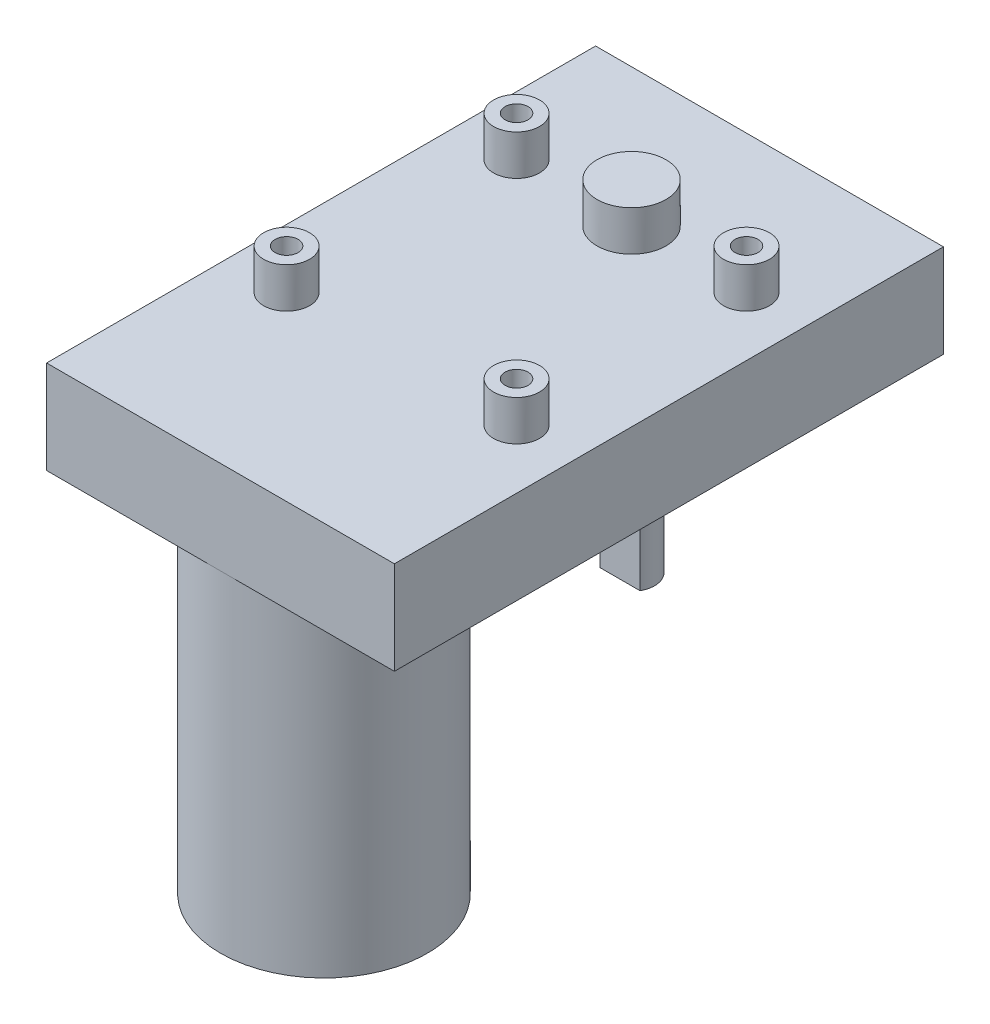
ISO-10303-21;
HEADER;
FILE_DESCRIPTION(('STEP AP214'),'2;1');
FILE_NAME('part.step','',(''),(''),'','','');
FILE_SCHEMA(('AUTOMOTIVE_DESIGN { 1 0 10303 214 1 1 1 1 }'));
ENDSEC;
DATA;
#1=APPLICATION_CONTEXT('core data for automotive mechanical design processes');
#2=APPLICATION_PROTOCOL_DEFINITION('international standard','automotive_design',2000,#1);
#3=PRODUCT_CONTEXT('',#1,'mechanical');
#4=PRODUCT('Part','Part','',(#3));
#5=PRODUCT_RELATED_PRODUCT_CATEGORY('part','',(#4));
#6=PRODUCT_DEFINITION_FORMATION('','',#4);
#7=PRODUCT_DEFINITION_CONTEXT('part definition',#1,'design');
#8=PRODUCT_DEFINITION('design','',#6,#7);
#9=PRODUCT_DEFINITION_SHAPE('','',#8);
#10=(LENGTH_UNIT() NAMED_UNIT(*) SI_UNIT(.MILLI.,.METRE.));
#11=(NAMED_UNIT(*) PLANE_ANGLE_UNIT() SI_UNIT($,.RADIAN.));
#12=(NAMED_UNIT(*) SI_UNIT($,.STERADIAN.) SOLID_ANGLE_UNIT());
#13=UNCERTAINTY_MEASURE_WITH_UNIT(LENGTH_MEASURE(1.E-05),#10,'distance_accuracy_value','');
#14=(GEOMETRIC_REPRESENTATION_CONTEXT(3) GLOBAL_UNCERTAINTY_ASSIGNED_CONTEXT((#13)) GLOBAL_UNIT_ASSIGNED_CONTEXT((#10,
#11,#12)) REPRESENTATION_CONTEXT('',''));
#15=CARTESIAN_POINT('',(0.,0.,0.));
#16=DIRECTION('',(0.,0.,1.));
#17=DIRECTION('',(1.,0.,0.));
#18=AXIS2_PLACEMENT_3D('',#15,#16,#17);
#19=CARTESIAN_POINT('',(-30.25,16.2,71.5));
#20=DIRECTION('',(-1.,0.,0.));
#21=DIRECTION('',(0.,0.,1.));
#22=AXIS2_PLACEMENT_3D('',#19,#20,#21);
#23=PLANE('',#22);
#24=DIRECTION('',(0.,0.,-1.));
#25=VECTOR('',#24,1.);
#26=CARTESIAN_POINT('',(-30.25,0.,71.5));
#27=LINE('',#26,#25);
#28=CARTESIAN_POINT('',(-30.25,0.,71.5));
#29=VERTEX_POINT('',#28);
#30=CARTESIAN_POINT('',(-30.25,0.,-24.));
#31=VERTEX_POINT('',#30);
#32=EDGE_CURVE('E164',#29,#31,#27,.T.);
#33=ORIENTED_EDGE('',*,*,#32,.F.);
#34=DIRECTION('',(0.,-1.,0.));
#35=VECTOR('',#34,1.);
#36=CARTESIAN_POINT('',(-30.25,16.2,71.5));
#37=LINE('',#36,#35);
#38=CARTESIAN_POINT('',(-30.25,16.2,71.5));
#39=VERTEX_POINT('',#38);
#40=EDGE_CURVE('E188',#39,#29,#37,.T.);
#41=ORIENTED_EDGE('',*,*,#40,.F.);
#42=DIRECTION('',(0.,0.,-1.));
#43=VECTOR('',#42,1.);
#44=CARTESIAN_POINT('',(-30.25,16.2,71.5));
#45=LINE('',#44,#43);
#46=CARTESIAN_POINT('',(-30.25,16.2,-24.));
#47=VERTEX_POINT('',#46);
#48=EDGE_CURVE('E165',#39,#47,#45,.T.);
#49=ORIENTED_EDGE('',*,*,#48,.T.);
#50=DIRECTION('',(0.,-1.,0.));
#51=VECTOR('',#50,1.);
#52=CARTESIAN_POINT('',(-30.25,16.2,-24.));
#53=LINE('',#52,#51);
#54=EDGE_CURVE('E176',#47,#31,#53,.T.);
#55=ORIENTED_EDGE('',*,*,#54,.T.);
#56=EDGE_LOOP('',(#33,#41,#49,#55));
#57=FACE_BOUND('',#56,.T.);
#58=ADVANCED_FACE('F41',(#57),#23,.T.);
#59=CARTESIAN_POINT('',(-30.25,16.2,71.5));
#60=DIRECTION('',(0.,0.,-1.));
#61=DIRECTION('',(-1.,0.,0.));
#62=AXIS2_PLACEMENT_3D('',#59,#60,#61);
#63=PLANE('',#62);
#64=DIRECTION('',(1.,0.,0.));
#65=VECTOR('',#64,1.);
#66=CARTESIAN_POINT('',(-30.25,0.,71.5));
#67=LINE('',#66,#65);
#68=CARTESIAN_POINT('',(0.,0.,71.5));
#69=VERTEX_POINT('',#68);
#70=EDGE_CURVE('E169',#29,#69,#67,.T.);
#71=ORIENTED_EDGE('',*,*,#70,.T.);
#72=CARTESIAN_POINT('',(30.25,0.,71.5));
#73=VERTEX_POINT('',#72);
#74=EDGE_CURVE('E185',#69,#73,#67,.T.);
#75=ORIENTED_EDGE('',*,*,#74,.T.);
#76=DIRECTION('',(0.,-1.,0.));
#77=VECTOR('',#76,1.);
#78=CARTESIAN_POINT('',(30.25,16.2,71.5));
#79=LINE('',#78,#77);
#80=CARTESIAN_POINT('',(30.25,16.2,71.5));
#81=VERTEX_POINT('',#80);
#82=EDGE_CURVE('E191',#81,#73,#79,.T.);
#83=ORIENTED_EDGE('',*,*,#82,.F.);
#84=DIRECTION('',(1.,0.,0.));
#85=VECTOR('',#84,1.);
#86=CARTESIAN_POINT('',(-30.25,16.2,71.5));
#87=LINE('',#86,#85);
#88=EDGE_CURVE('E174',#39,#81,#87,.T.);
#89=ORIENTED_EDGE('',*,*,#88,.F.);
#90=ORIENTED_EDGE('',*,*,#40,.T.);
#91=EDGE_LOOP('',(#71,#75,#83,#89,#90));
#92=FACE_BOUND('',#91,.T.);
#93=ADVANCED_FACE('F250',(#92),#63,.F.);
#94=CARTESIAN_POINT('',(30.25,16.2,71.5));
#95=DIRECTION('',(-1.,0.,0.));
#96=DIRECTION('',(0.,0.,1.));
#97=AXIS2_PLACEMENT_3D('',#94,#95,#96);
#98=PLANE('',#97);
#99=DIRECTION('',(0.,0.,-1.));
#100=VECTOR('',#99,1.);
#101=CARTESIAN_POINT('',(30.25,0.,71.5));
#102=LINE('',#101,#100);
#103=CARTESIAN_POINT('',(30.25,0.,-24.));
#104=VERTEX_POINT('',#103);
#105=EDGE_CURVE('E182',#73,#104,#102,.T.);
#106=ORIENTED_EDGE('',*,*,#105,.T.);
#107=DIRECTION('',(0.,-1.,0.));
#108=VECTOR('',#107,1.);
#109=CARTESIAN_POINT('',(30.25,16.2,-24.));
#110=LINE('',#109,#108);
#111=CARTESIAN_POINT('',(30.25,16.2,-24.));
#112=VERTEX_POINT('',#111);
#113=EDGE_CURVE('E194',#112,#104,#110,.T.);
#114=ORIENTED_EDGE('',*,*,#113,.F.);
#115=DIRECTION('',(0.,0.,-1.));
#116=VECTOR('',#115,1.);
#117=CARTESIAN_POINT('',(30.25,16.2,71.5));
#118=LINE('',#117,#116);
#119=EDGE_CURVE('E172',#81,#112,#118,.T.);
#120=ORIENTED_EDGE('',*,*,#119,.F.);
#121=ORIENTED_EDGE('',*,*,#82,.T.);
#122=EDGE_LOOP('',(#106,#114,#120,#121));
#123=FACE_BOUND('',#122,.T.);
#124=ADVANCED_FACE('F255',(#123),#98,.F.);
#125=CARTESIAN_POINT('',(-30.25,16.2,-24.));
#126=DIRECTION('',(0.,0.,-1.));
#127=DIRECTION('',(-1.,0.,0.));
#128=AXIS2_PLACEMENT_3D('',#125,#126,#127);
#129=PLANE('',#128);
#130=DIRECTION('',(1.,0.,0.));
#131=VECTOR('',#130,1.);
#132=CARTESIAN_POINT('',(-30.25,0.,-24.));
#133=LINE('',#132,#131);
#134=EDGE_CURVE('E179',#31,#104,#133,.T.);
#135=ORIENTED_EDGE('',*,*,#134,.F.);
#136=ORIENTED_EDGE('',*,*,#54,.F.);
#137=DIRECTION('',(1.,0.,0.));
#138=VECTOR('',#137,1.);
#139=CARTESIAN_POINT('',(-30.25,16.2,-24.));
#140=LINE('',#139,#138);
#141=EDGE_CURVE('E168',#47,#112,#140,.T.);
#142=ORIENTED_EDGE('',*,*,#141,.T.);
#143=ORIENTED_EDGE('',*,*,#113,.T.);
#144=EDGE_LOOP('',(#135,#136,#142,#143));
#145=FACE_BOUND('',#144,.T.);
#146=ADVANCED_FACE('F272',(#145),#129,.T.);
#147=CARTESIAN_POINT('',(0.,16.2,0.));
#148=DIRECTION('',(0.,-1.,0.));
#149=DIRECTION('',(0.,0.,-1.));
#150=AXIS2_PLACEMENT_3D('',#147,#148,#149);
#151=PLANE('',#150);
#152=CARTESIAN_POINT('',(-20.,16.2,40.));
#153=DIRECTION('',(0.,-1.,0.));
#154=DIRECTION('',(0.,0.,-1.));
#155=AXIS2_PLACEMENT_3D('',#152,#153,#154);
#156=CIRCLE('',#155,4.);
#157=CARTESIAN_POINT('',(-20.,16.2,36.));
#158=VERTEX_POINT('',#157);
#159=EDGE_CURVE('E208',#158,#158,#156,.F.);
#160=ORIENTED_EDGE('',*,*,#159,.F.);
#161=EDGE_LOOP('',(#160));
#162=FACE_BOUND('',#161,.T.);
#163=CARTESIAN_POINT('',(20.,16.2,40.));
#164=DIRECTION('',(0.,-1.,0.));
#165=DIRECTION('',(0.,0.,-1.));
#166=AXIS2_PLACEMENT_3D('',#163,#164,#165);
#167=CIRCLE('',#166,4.);
#168=CARTESIAN_POINT('',(20.,16.2,36.));
#169=VERTEX_POINT('',#168);
#170=EDGE_CURVE('E205',#169,#169,#167,.F.);
#171=ORIENTED_EDGE('',*,*,#170,.F.);
#172=EDGE_LOOP('',(#171));
#173=FACE_BOUND('',#172,.T.);
#174=CARTESIAN_POINT('',(20.,16.2,0.));
#175=DIRECTION('',(0.,-1.,0.));
#176=DIRECTION('',(0.,0.,-1.));
#177=AXIS2_PLACEMENT_3D('',#174,#175,#176);
#178=CIRCLE('',#177,4.);
#179=CARTESIAN_POINT('',(20.,16.2,-4.));
#180=VERTEX_POINT('',#179);
#181=EDGE_CURVE('E202',#180,#180,#178,.F.);
#182=ORIENTED_EDGE('',*,*,#181,.F.);
#183=EDGE_LOOP('',(#182));
#184=FACE_BOUND('',#183,.T.);
#185=CARTESIAN_POINT('',(-20.,16.2,0.));
#186=DIRECTION('',(0.,-1.,0.));
#187=DIRECTION('',(0.,0.,-1.));
#188=AXIS2_PLACEMENT_3D('',#185,#186,#187);
#189=CIRCLE('',#188,4.);
#190=CARTESIAN_POINT('',(-20.,16.2,-4.));
#191=VERTEX_POINT('',#190);
#192=EDGE_CURVE('E199',#191,#191,#189,.F.);
#193=ORIENTED_EDGE('',*,*,#192,.F.);
#194=EDGE_LOOP('',(#193));
#195=FACE_BOUND('',#194,.T.);
#196=CARTESIAN_POINT('',(0.,16.2,0.));
#197=DIRECTION('',(0.,-1.,0.));
#198=DIRECTION('',(0.,0.,-1.));
#199=AXIS2_PLACEMENT_3D('',#196,#197,#198);
#200=CIRCLE('',#199,6.);
#201=CARTESIAN_POINT('',(0.,16.2,-6.));
#202=VERTEX_POINT('',#201);
#203=EDGE_CURVE('E190',#202,#202,#200,.F.);
#204=ORIENTED_EDGE('',*,*,#203,.F.);
#205=EDGE_LOOP('',(#204));
#206=FACE_BOUND('',#205,.T.);
#207=ORIENTED_EDGE('',*,*,#48,.F.);
#208=ORIENTED_EDGE('',*,*,#88,.T.);
#209=ORIENTED_EDGE('',*,*,#119,.T.);
#210=ORIENTED_EDGE('',*,*,#141,.F.);
#211=EDGE_LOOP('',(#207,#208,#209,#210));
#212=FACE_BOUND('',#211,.T.);
#213=ADVANCED_FACE('F269',(#162,#173,#184,#195,#206,#212),#151,.F.);
#214=CARTESIAN_POINT('',(0.,0.,0.));
#215=DIRECTION('',(0.,-1.,0.));
#216=DIRECTION('',(0.,0.,-1.));
#217=AXIS2_PLACEMENT_3D('',#214,#215,#216);
#218=PLANE('',#217);
#219=CARTESIAN_POINT('',(17.5,0.,12.5));
#220=DIRECTION('',(0.,-1.,0.));
#221=DIRECTION('',(0.,0.,-1.));
#222=AXIS2_PLACEMENT_3D('',#219,#220,#221);
#223=CIRCLE('',#222,4.);
#224=CARTESIAN_POINT('',(17.5,0.,8.5));
#225=VERTEX_POINT('',#224);
#226=EDGE_CURVE('E688',#225,#225,#223,.T.);
#227=ORIENTED_EDGE('',*,*,#226,.F.);
#228=EDGE_LOOP('',(#227));
#229=FACE_BOUND('',#228,.T.);
#230=CARTESIAN_POINT('',(-17.5,0.,12.5));
#231=DIRECTION('',(0.,-1.,0.));
#232=DIRECTION('',(0.,0.,-1.));
#233=AXIS2_PLACEMENT_3D('',#230,#231,#232);
#234=CIRCLE('',#233,4.);
#235=CARTESIAN_POINT('',(-17.5,0.,8.5));
#236=VERTEX_POINT('',#235);
#237=EDGE_CURVE('E700',#236,#236,#234,.T.);
#238=ORIENTED_EDGE('',*,*,#237,.F.);
#239=EDGE_LOOP('',(#238));
#240=FACE_BOUND('',#239,.T.);
#241=CARTESIAN_POINT('',(-17.5,0.,-12.5));
#242=DIRECTION('',(0.,-1.,0.));
#243=DIRECTION('',(0.,0.,-1.));
#244=AXIS2_PLACEMENT_3D('',#241,#242,#243);
#245=CIRCLE('',#244,4.);
#246=CARTESIAN_POINT('',(-17.5,0.,-16.5));
#247=VERTEX_POINT('',#246);
#248=EDGE_CURVE('E709',#247,#247,#245,.T.);
#249=ORIENTED_EDGE('',*,*,#248,.F.);
#250=EDGE_LOOP('',(#249));
#251=FACE_BOUND('',#250,.T.);
#252=CARTESIAN_POINT('',(17.5,0.,-12.5));
#253=DIRECTION('',(0.,-1.,0.));
#254=DIRECTION('',(0.,0.,-1.));
#255=AXIS2_PLACEMENT_3D('',#252,#253,#254);
#256=CIRCLE('',#255,4.);
#257=CARTESIAN_POINT('',(17.5,0.,-16.5));
#258=VERTEX_POINT('',#257);
#259=EDGE_CURVE('E718',#258,#258,#256,.T.);
#260=ORIENTED_EDGE('',*,*,#259,.F.);
#261=EDGE_LOOP('',(#260));
#262=FACE_BOUND('',#261,.T.);
#263=CARTESIAN_POINT('',(0.,0.,0.));
#264=DIRECTION('',(0.,-1.,0.));
#265=DIRECTION('',(0.,0.,-1.));
#266=AXIS2_PLACEMENT_3D('',#263,#264,#265);
#267=CIRCLE('',#266,6.);
#268=CARTESIAN_POINT('',(0.,0.,-6.));
#269=VERTEX_POINT('',#268);
#270=EDGE_CURVE('E117',#269,#269,#267,.T.);
#271=ORIENTED_EDGE('',*,*,#270,.F.);
#272=EDGE_LOOP('',(#271));
#273=FACE_BOUND('',#272,.T.);
#274=ORIENTED_EDGE('',*,*,#74,.F.);
#275=CARTESIAN_POINT('',(0.,0.,53.5));
#276=DIRECTION('',(0.,-1.,0.));
#277=DIRECTION('',(0.,0.,-1.));
#278=AXIS2_PLACEMENT_3D('',#275,#276,#277);
#279=CIRCLE('',#278,18.);
#280=EDGE_CURVE('E53',#69,#69,#279,.T.);
#281=ORIENTED_EDGE('',*,*,#280,.F.);
#282=ORIENTED_EDGE('',*,*,#70,.F.);
#283=ORIENTED_EDGE('',*,*,#32,.T.);
#284=ORIENTED_EDGE('',*,*,#134,.T.);
#285=ORIENTED_EDGE('',*,*,#105,.F.);
#286=EDGE_LOOP('',(#274,#281,#282,#283,#284,#285));
#287=FACE_BOUND('',#286,.T.);
#288=ADVANCED_FACE('F237',(#229,#240,#251,#262,#273,#287),#218,.T.);
#289=CARTESIAN_POINT('',(0.,23.2,0.));
#290=DIRECTION('',(0.,-1.,0.));
#291=DIRECTION('',(0.,0.,-1.));
#292=AXIS2_PLACEMENT_3D('',#289,#290,#291);
#293=CYLINDRICAL_SURFACE('',#292,6.);
#294=CARTESIAN_POINT('',(0.,23.2,0.));
#295=DIRECTION('',(0.,1.,0.));
#296=DIRECTION('',(0.,0.,1.));
#297=AXIS2_PLACEMENT_3D('',#294,#295,#296);
#298=CIRCLE('',#297,6.);
#299=CARTESIAN_POINT('',(0.,23.2,6.));
#300=VERTEX_POINT('',#299);
#301=EDGE_CURVE('E161',#300,#300,#298,.T.);
#302=ORIENTED_EDGE('',*,*,#301,.F.);
#303=EDGE_LOOP('',(#302));
#304=FACE_BOUND('',#303,.T.);
#305=ORIENTED_EDGE('',*,*,#203,.T.);
#306=EDGE_LOOP('',(#305));
#307=FACE_BOUND('',#306,.T.);
#308=ADVANCED_FACE('F288',(#304,#307),#293,.T.);
#309=CARTESIAN_POINT('',(0.,23.2,0.));
#310=DIRECTION('',(0.,1.,0.));
#311=DIRECTION('',(0.,0.,1.));
#312=AXIS2_PLACEMENT_3D('',#309,#310,#311);
#313=PLANE('',#312);
#314=ORIENTED_EDGE('',*,*,#301,.T.);
#315=EDGE_LOOP('',(#314));
#316=FACE_BOUND('',#315,.T.);
#317=ADVANCED_FACE('F354',(#316),#313,.T.);
#318=CARTESIAN_POINT('',(-20.,23.2,0.));
#319=DIRECTION('',(0.,1.,0.));
#320=DIRECTION('',(0.,0.,1.));
#321=AXIS2_PLACEMENT_3D('',#318,#319,#320);
#322=PLANE('',#321);
#323=CARTESIAN_POINT('',(-20.,23.2,0.));
#324=DIRECTION('',(0.,1.,0.));
#325=DIRECTION('',(0.,0.,1.));
#326=AXIS2_PLACEMENT_3D('',#323,#324,#325);
#327=CIRCLE('',#326,4.);
#328=CARTESIAN_POINT('',(-20.,23.2,4.));
#329=VERTEX_POINT('',#328);
#330=EDGE_CURVE('E156',#329,#329,#327,.T.);
#331=ORIENTED_EDGE('',*,*,#330,.T.);
#332=EDGE_LOOP('',(#331));
#333=FACE_BOUND('',#332,.T.);
#334=CARTESIAN_POINT('',(-20.,23.2,0.));
#335=DIRECTION('',(0.,1.,0.));
#336=DIRECTION('',(0.,0.,1.));
#337=AXIS2_PLACEMENT_3D('',#334,#335,#336);
#338=CIRCLE('',#337,2.);
#339=CARTESIAN_POINT('',(-20.,23.2,2.));
#340=VERTEX_POINT('',#339);
#341=EDGE_CURVE('E153',#340,#340,#338,.T.);
#342=ORIENTED_EDGE('',*,*,#341,.F.);
#343=EDGE_LOOP('',(#342));
#344=FACE_BOUND('',#343,.T.);
#345=ADVANCED_FACE('F351',(#333,#344),#322,.T.);
#346=CARTESIAN_POINT('',(-20.,23.2,0.));
#347=DIRECTION('',(0.,-1.,0.));
#348=DIRECTION('',(0.,0.,-1.));
#349=AXIS2_PLACEMENT_3D('',#346,#347,#348);
#350=CYLINDRICAL_SURFACE('',#349,4.);
#351=ORIENTED_EDGE('',*,*,#330,.F.);
#352=EDGE_LOOP('',(#351));
#353=FACE_BOUND('',#352,.T.);
#354=ORIENTED_EDGE('',*,*,#192,.T.);
#355=EDGE_LOOP('',(#354));
#356=FACE_BOUND('',#355,.T.);
#357=ADVANCED_FACE('F310',(#353,#356),#350,.T.);
#358=CARTESIAN_POINT('',(-20.,23.2,0.));
#359=DIRECTION('',(0.,-1.,0.));
#360=DIRECTION('',(0.,0.,-1.));
#361=AXIS2_PLACEMENT_3D('',#358,#359,#360);
#362=CYLINDRICAL_SURFACE('',#361,2.);
#363=ORIENTED_EDGE('',*,*,#341,.T.);
#364=EDGE_LOOP('',(#363));
#365=FACE_BOUND('',#364,.T.);
#366=CARTESIAN_POINT('',(-20.,16.2,0.));
#367=DIRECTION('',(0.,1.,0.));
#368=DIRECTION('',(0.,0.,1.));
#369=AXIS2_PLACEMENT_3D('',#366,#367,#368);
#370=CIRCLE('',#369,2.);
#371=CARTESIAN_POINT('',(-20.,16.2,2.));
#372=VERTEX_POINT('',#371);
#373=EDGE_CURVE('E152',#372,#372,#370,.T.);
#374=ORIENTED_EDGE('',*,*,#373,.F.);
#375=EDGE_LOOP('',(#374));
#376=FACE_BOUND('',#375,.T.);
#377=ADVANCED_FACE('F300',(#365,#376),#362,.F.);
#378=ORIENTED_EDGE('',*,*,#373,.T.);
#379=EDGE_LOOP('',(#378));
#380=FACE_BOUND('',#379,.T.);
#381=ADVANCED_FACE('F284',(#380),#151,.F.);
#382=CARTESIAN_POINT('',(20.,23.2,0.));
#383=DIRECTION('',(0.,1.,0.));
#384=DIRECTION('',(0.,0.,1.));
#385=AXIS2_PLACEMENT_3D('',#382,#383,#384);
#386=PLANE('',#385);
#387=CARTESIAN_POINT('',(20.,23.2,0.));
#388=DIRECTION('',(0.,1.,0.));
#389=DIRECTION('',(0.,0.,1.));
#390=AXIS2_PLACEMENT_3D('',#387,#388,#389);
#391=CIRCLE('',#390,4.);
#392=CARTESIAN_POINT('',(20.,23.2,4.));
#393=VERTEX_POINT('',#392);
#394=EDGE_CURVE('E147',#393,#393,#391,.T.);
#395=ORIENTED_EDGE('',*,*,#394,.T.);
#396=EDGE_LOOP('',(#395));
#397=FACE_BOUND('',#396,.T.);
#398=CARTESIAN_POINT('',(20.,23.2,0.));
#399=DIRECTION('',(0.,1.,0.));
#400=DIRECTION('',(0.,0.,1.));
#401=AXIS2_PLACEMENT_3D('',#398,#399,#400);
#402=CIRCLE('',#401,2.);
#403=CARTESIAN_POINT('',(20.,23.2,2.));
#404=VERTEX_POINT('',#403);
#405=EDGE_CURVE('E144',#404,#404,#402,.T.);
#406=ORIENTED_EDGE('',*,*,#405,.F.);
#407=EDGE_LOOP('',(#406));
#408=FACE_BOUND('',#407,.T.);
#409=ADVANCED_FACE('F299',(#397,#408),#386,.T.);
#410=CARTESIAN_POINT('',(20.,23.2,0.));
#411=DIRECTION('',(0.,-1.,0.));
#412=DIRECTION('',(0.,0.,-1.));
#413=AXIS2_PLACEMENT_3D('',#410,#411,#412);
#414=CYLINDRICAL_SURFACE('',#413,4.);
#415=ORIENTED_EDGE('',*,*,#394,.F.);
#416=EDGE_LOOP('',(#415));
#417=FACE_BOUND('',#416,.T.);
#418=ORIENTED_EDGE('',*,*,#181,.T.);
#419=EDGE_LOOP('',(#418));
#420=FACE_BOUND('',#419,.T.);
#421=ADVANCED_FACE('F307',(#417,#420),#414,.T.);
#422=CARTESIAN_POINT('',(20.,23.2,0.));
#423=DIRECTION('',(0.,-1.,0.));
#424=DIRECTION('',(0.,0.,-1.));
#425=AXIS2_PLACEMENT_3D('',#422,#423,#424);
#426=CYLINDRICAL_SURFACE('',#425,2.);
#427=ORIENTED_EDGE('',*,*,#405,.T.);
#428=EDGE_LOOP('',(#427));
#429=FACE_BOUND('',#428,.T.);
#430=CARTESIAN_POINT('',(20.,16.2,0.));
#431=DIRECTION('',(0.,1.,0.));
#432=DIRECTION('',(0.,0.,1.));
#433=AXIS2_PLACEMENT_3D('',#430,#431,#432);
#434=CIRCLE('',#433,2.);
#435=CARTESIAN_POINT('',(20.,16.2,2.));
#436=VERTEX_POINT('',#435);
#437=EDGE_CURVE('E143',#436,#436,#434,.T.);
#438=ORIENTED_EDGE('',*,*,#437,.F.);
#439=EDGE_LOOP('',(#438));
#440=FACE_BOUND('',#439,.T.);
#441=ADVANCED_FACE('F315',(#429,#440),#426,.F.);
#442=ORIENTED_EDGE('',*,*,#437,.T.);
#443=EDGE_LOOP('',(#442));
#444=FACE_BOUND('',#443,.T.);
#445=ADVANCED_FACE('F302',(#444),#151,.F.);
#446=CARTESIAN_POINT('',(20.,23.2,40.));
#447=DIRECTION('',(0.,1.,0.));
#448=DIRECTION('',(0.,0.,1.));
#449=AXIS2_PLACEMENT_3D('',#446,#447,#448);
#450=PLANE('',#449);
#451=CARTESIAN_POINT('',(20.,23.2,40.));
#452=DIRECTION('',(0.,1.,0.));
#453=DIRECTION('',(0.,0.,1.));
#454=AXIS2_PLACEMENT_3D('',#451,#452,#453);
#455=CIRCLE('',#454,4.);
#456=CARTESIAN_POINT('',(20.,23.2,44.));
#457=VERTEX_POINT('',#456);
#458=EDGE_CURVE('E138',#457,#457,#455,.T.);
#459=ORIENTED_EDGE('',*,*,#458,.T.);
#460=EDGE_LOOP('',(#459));
#461=FACE_BOUND('',#460,.T.);
#462=CARTESIAN_POINT('',(20.,23.2,40.));
#463=DIRECTION('',(0.,1.,0.));
#464=DIRECTION('',(0.,0.,1.));
#465=AXIS2_PLACEMENT_3D('',#462,#463,#464);
#466=CIRCLE('',#465,2.);
#467=CARTESIAN_POINT('',(20.,23.2,42.));
#468=VERTEX_POINT('',#467);
#469=EDGE_CURVE('E135',#468,#468,#466,.T.);
#470=ORIENTED_EDGE('',*,*,#469,.F.);
#471=EDGE_LOOP('',(#470));
#472=FACE_BOUND('',#471,.T.);
#473=ADVANCED_FACE('F314',(#461,#472),#450,.T.);
#474=CARTESIAN_POINT('',(20.,23.2,40.));
#475=DIRECTION('',(0.,-1.,0.));
#476=DIRECTION('',(0.,0.,-1.));
#477=AXIS2_PLACEMENT_3D('',#474,#475,#476);
#478=CYLINDRICAL_SURFACE('',#477,4.);
#479=ORIENTED_EDGE('',*,*,#458,.F.);
#480=EDGE_LOOP('',(#479));
#481=FACE_BOUND('',#480,.T.);
#482=ORIENTED_EDGE('',*,*,#170,.T.);
#483=EDGE_LOOP('',(#482));
#484=FACE_BOUND('',#483,.T.);
#485=ADVANCED_FACE('F321',(#481,#484),#478,.T.);
#486=CARTESIAN_POINT('',(20.,23.2,40.));
#487=DIRECTION('',(0.,-1.,0.));
#488=DIRECTION('',(0.,0.,-1.));
#489=AXIS2_PLACEMENT_3D('',#486,#487,#488);
#490=CYLINDRICAL_SURFACE('',#489,2.);
#491=ORIENTED_EDGE('',*,*,#469,.T.);
#492=EDGE_LOOP('',(#491));
#493=FACE_BOUND('',#492,.T.);
#494=CARTESIAN_POINT('',(20.,16.2,40.));
#495=DIRECTION('',(0.,1.,0.));
#496=DIRECTION('',(0.,0.,1.));
#497=AXIS2_PLACEMENT_3D('',#494,#495,#496);
#498=CIRCLE('',#497,2.);
#499=CARTESIAN_POINT('',(20.,16.2,42.));
#500=VERTEX_POINT('',#499);
#501=EDGE_CURVE('E134',#500,#500,#498,.T.);
#502=ORIENTED_EDGE('',*,*,#501,.F.);
#503=EDGE_LOOP('',(#502));
#504=FACE_BOUND('',#503,.T.);
#505=ADVANCED_FACE('F328',(#493,#504),#490,.F.);
#506=ORIENTED_EDGE('',*,*,#501,.T.);
#507=EDGE_LOOP('',(#506));
#508=FACE_BOUND('',#507,.T.);
#509=ADVANCED_FACE('F297',(#508),#151,.F.);
#510=CARTESIAN_POINT('',(-20.,23.2,40.));
#511=DIRECTION('',(0.,1.,0.));
#512=DIRECTION('',(0.,0.,1.));
#513=AXIS2_PLACEMENT_3D('',#510,#511,#512);
#514=PLANE('',#513);
#515=CARTESIAN_POINT('',(-20.,23.2,40.));
#516=DIRECTION('',(0.,1.,0.));
#517=DIRECTION('',(0.,0.,1.));
#518=AXIS2_PLACEMENT_3D('',#515,#516,#517);
#519=CIRCLE('',#518,4.);
#520=CARTESIAN_POINT('',(-20.,23.2,44.));
#521=VERTEX_POINT('',#520);
#522=EDGE_CURVE('E129',#521,#521,#519,.T.);
#523=ORIENTED_EDGE('',*,*,#522,.T.);
#524=EDGE_LOOP('',(#523));
#525=FACE_BOUND('',#524,.T.);
#526=CARTESIAN_POINT('',(-20.,23.2,40.));
#527=DIRECTION('',(0.,1.,0.));
#528=DIRECTION('',(0.,0.,1.));
#529=AXIS2_PLACEMENT_3D('',#526,#527,#528);
#530=CIRCLE('',#529,2.);
#531=CARTESIAN_POINT('',(-20.,23.2,42.));
#532=VERTEX_POINT('',#531);
#533=EDGE_CURVE('E126',#532,#532,#530,.T.);
#534=ORIENTED_EDGE('',*,*,#533,.F.);
#535=EDGE_LOOP('',(#534));
#536=FACE_BOUND('',#535,.T.);
#537=ADVANCED_FACE('F327',(#525,#536),#514,.T.);
#538=CARTESIAN_POINT('',(-20.,23.2,40.));
#539=DIRECTION('',(0.,-1.,0.));
#540=DIRECTION('',(0.,0.,-1.));
#541=AXIS2_PLACEMENT_3D('',#538,#539,#540);
#542=CYLINDRICAL_SURFACE('',#541,4.);
#543=ORIENTED_EDGE('',*,*,#522,.F.);
#544=EDGE_LOOP('',(#543));
#545=FACE_BOUND('',#544,.T.);
#546=ORIENTED_EDGE('',*,*,#159,.T.);
#547=EDGE_LOOP('',(#546));
#548=FACE_BOUND('',#547,.T.);
#549=ADVANCED_FACE('F334',(#545,#548),#542,.T.);
#550=CARTESIAN_POINT('',(-20.,23.2,40.));
#551=DIRECTION('',(0.,-1.,0.));
#552=DIRECTION('',(0.,0.,-1.));
#553=AXIS2_PLACEMENT_3D('',#550,#551,#552);
#554=CYLINDRICAL_SURFACE('',#553,2.);
#555=ORIENTED_EDGE('',*,*,#533,.T.);
#556=EDGE_LOOP('',(#555));
#557=FACE_BOUND('',#556,.T.);
#558=CARTESIAN_POINT('',(-20.,16.2,40.));
#559=DIRECTION('',(0.,1.,0.));
#560=DIRECTION('',(0.,0.,1.));
#561=AXIS2_PLACEMENT_3D('',#558,#559,#560);
#562=CIRCLE('',#561,2.);
#563=CARTESIAN_POINT('',(-20.,16.2,42.));
#564=VERTEX_POINT('',#563);
#565=EDGE_CURVE('E123',#564,#564,#562,.T.);
#566=ORIENTED_EDGE('',*,*,#565,.F.);
#567=EDGE_LOOP('',(#566));
#568=FACE_BOUND('',#567,.T.);
#569=ADVANCED_FACE('F295',(#557,#568),#554,.F.);
#570=ORIENTED_EDGE('',*,*,#565,.T.);
#571=EDGE_LOOP('',(#570));
#572=FACE_BOUND('',#571,.T.);
#573=ADVANCED_FACE('F283',(#572),#151,.F.);
#574=CARTESIAN_POINT('',(0.,-6.,0.));
#575=DIRECTION('',(0.,1.,0.));
#576=DIRECTION('',(0.,0.,1.));
#577=AXIS2_PLACEMENT_3D('',#574,#575,#576);
#578=CYLINDRICAL_SURFACE('',#577,6.);
#579=CARTESIAN_POINT('',(0.,-6.,0.));
#580=DIRECTION('',(0.,-1.,0.));
#581=DIRECTION('',(0.,0.,-1.));
#582=AXIS2_PLACEMENT_3D('',#579,#580,#581);
#583=CIRCLE('',#582,6.);
#584=CARTESIAN_POINT('',(0.,-6.,-6.));
#585=VERTEX_POINT('',#584);
#586=EDGE_CURVE('E120',#585,#585,#583,.T.);
#587=ORIENTED_EDGE('',*,*,#586,.F.);
#588=EDGE_LOOP('',(#587));
#589=FACE_BOUND('',#588,.T.);
#590=ORIENTED_EDGE('',*,*,#270,.T.);
#591=EDGE_LOOP('',(#590));
#592=FACE_BOUND('',#591,.T.);
#593=ADVANCED_FACE('F294',(#589,#592),#578,.T.);
#594=CARTESIAN_POINT('',(0.,-6.,0.));
#595=DIRECTION('',(0.,-1.,0.));
#596=DIRECTION('',(0.,0.,-1.));
#597=AXIS2_PLACEMENT_3D('',#594,#595,#596);
#598=PLANE('',#597);
#599=CARTESIAN_POINT('',(0.,-6.,0.));
#600=DIRECTION('',(0.,1.,0.));
#601=DIRECTION('',(0.,0.,1.));
#602=AXIS2_PLACEMENT_3D('',#599,#600,#601);
#603=CIRCLE('',#602,4.);
#604=CARTESIAN_POINT('',(0.,-6.,4.));
#605=VERTEX_POINT('',#604);
#606=EDGE_CURVE('E112',#605,#605,#603,.T.);
#607=ORIENTED_EDGE('',*,*,#606,.T.);
#608=EDGE_LOOP('',(#607));
#609=FACE_BOUND('',#608,.T.);
#610=ORIENTED_EDGE('',*,*,#586,.T.);
#611=EDGE_LOOP('',(#610));
#612=FACE_BOUND('',#611,.T.);
#613=ADVANCED_FACE('F472',(#609,#612),#598,.T.);
#614=CARTESIAN_POINT('',(0.,-36.,0.));
#615=DIRECTION('',(0.,1.,0.));
#616=DIRECTION('',(0.,0.,1.));
#617=AXIS2_PLACEMENT_3D('',#614,#615,#616);
#618=CYLINDRICAL_SURFACE('',#617,4.);
#619=DIRECTION('',(0.,-1.,0.));
#620=VECTOR('',#619,1.);
#621=CARTESIAN_POINT('',(-3.46410161513775,-20.,2.));
#622=LINE('',#621,#620);
#623=CARTESIAN_POINT('',(-3.46410161513775,-20.,2.));
#624=VERTEX_POINT('',#623);
#625=CARTESIAN_POINT('',(-3.46410161513775,-36.,2.));
#626=VERTEX_POINT('',#625);
#627=EDGE_CURVE('E60',#624,#626,#622,.T.);
#628=ORIENTED_EDGE('',*,*,#627,.F.);
#629=CARTESIAN_POINT('',(0.,-20.,0.));
#630=DIRECTION('',(0.,-1.,0.));
#631=DIRECTION('',(0.,0.,-1.));
#632=AXIS2_PLACEMENT_3D('',#629,#630,#631);
#633=CIRCLE('',#632,4.);
#634=CARTESIAN_POINT('',(3.46410161513775,-20.,2.));
#635=VERTEX_POINT('',#634);
#636=EDGE_CURVE('E96',#635,#624,#633,.T.);
#637=ORIENTED_EDGE('',*,*,#636,.F.);
#638=DIRECTION('',(0.,-1.,0.));
#639=VECTOR('',#638,1.);
#640=CARTESIAN_POINT('',(3.46410161513775,-20.,2.));
#641=LINE('',#640,#639);
#642=CARTESIAN_POINT('',(3.46410161513775,-36.,2.));
#643=VERTEX_POINT('',#642);
#644=EDGE_CURVE('E104',#635,#643,#641,.T.);
#645=ORIENTED_EDGE('',*,*,#644,.T.);
#646=CARTESIAN_POINT('',(0.,-36.,0.));
#647=DIRECTION('',(0.,1.,0.));
#648=DIRECTION('',(0.,0.,1.));
#649=AXIS2_PLACEMENT_3D('',#646,#647,#648);
#650=CIRCLE('',#649,4.);
#651=EDGE_CURVE('E110',#643,#626,#650,.T.);
#652=ORIENTED_EDGE('',*,*,#651,.T.);
#653=EDGE_LOOP('',(#628,#637,#645,#652));
#654=FACE_BOUND('',#653,.T.);
#655=ORIENTED_EDGE('',*,*,#606,.F.);
#656=EDGE_LOOP('',(#655));
#657=FACE_BOUND('',#656,.T.);
#658=ADVANCED_FACE('F107',(#654,#657),#618,.T.);
#659=CARTESIAN_POINT('',(0.,-36.,0.));
#660=DIRECTION('',(0.,1.,0.));
#661=DIRECTION('',(0.,0.,1.));
#662=AXIS2_PLACEMENT_3D('',#659,#660,#661);
#663=PLANE('',#662);
#664=ORIENTED_EDGE('',*,*,#651,.F.);
#665=DIRECTION('',(1.,0.,0.));
#666=VECTOR('',#665,1.);
#667=CARTESIAN_POINT('',(3.46410161513775,-36.,2.));
#668=LINE('',#667,#666);
#669=EDGE_CURVE('E101',#626,#643,#668,.T.);
#670=ORIENTED_EDGE('',*,*,#669,.F.);
#671=EDGE_LOOP('',(#664,#670));
#672=FACE_BOUND('',#671,.T.);
#673=ADVANCED_FACE('F491',(#672),#663,.F.);
#674=CARTESIAN_POINT('',(3.46410161513775,-20.,2.));
#675=DIRECTION('',(0.,0.,-1.));
#676=DIRECTION('',(-1.,0.,0.));
#677=AXIS2_PLACEMENT_3D('',#674,#675,#676);
#678=PLANE('',#677);
#679=ORIENTED_EDGE('',*,*,#669,.T.);
#680=ORIENTED_EDGE('',*,*,#644,.F.);
#681=DIRECTION('',(1.,0.,0.));
#682=VECTOR('',#681,1.);
#683=CARTESIAN_POINT('',(3.46410161513775,-20.,2.));
#684=LINE('',#683,#682);
#685=EDGE_CURVE('E98',#624,#635,#684,.T.);
#686=ORIENTED_EDGE('',*,*,#685,.F.);
#687=ORIENTED_EDGE('',*,*,#627,.T.);
#688=EDGE_LOOP('',(#679,#680,#686,#687));
#689=FACE_BOUND('',#688,.T.);
#690=ADVANCED_FACE('F103',(#689),#678,.F.);
#691=CARTESIAN_POINT('',(0.,-20.,0.));
#692=DIRECTION('',(0.,-1.,0.));
#693=DIRECTION('',(0.,0.,-1.));
#694=AXIS2_PLACEMENT_3D('',#691,#692,#693);
#695=PLANE('',#694);
#696=ORIENTED_EDGE('',*,*,#636,.T.);
#697=ORIENTED_EDGE('',*,*,#685,.T.);
#698=EDGE_LOOP('',(#696,#697));
#699=FACE_BOUND('',#698,.T.);
#700=ADVANCED_FACE('F97',(#699),#695,.T.);
#701=CARTESIAN_POINT('',(17.5,-8.,-12.5));
#702=DIRECTION('',(0.,-1.,0.));
#703=DIRECTION('',(0.,0.,-1.));
#704=AXIS2_PLACEMENT_3D('',#701,#702,#703);
#705=PLANE('',#704);
#706=CARTESIAN_POINT('',(17.5,-8.,-12.5));
#707=DIRECTION('',(0.,-1.,0.));
#708=DIRECTION('',(0.,0.,-1.));
#709=AXIS2_PLACEMENT_3D('',#706,#707,#708);
#710=CIRCLE('',#709,4.);
#711=CARTESIAN_POINT('',(17.5,-8.,-16.5));
#712=VERTEX_POINT('',#711);
#713=EDGE_CURVE('E719',#712,#712,#710,.T.);
#714=ORIENTED_EDGE('',*,*,#713,.T.);
#715=EDGE_LOOP('',(#714));
#716=FACE_BOUND('',#715,.T.);
#717=CARTESIAN_POINT('',(17.5,-8.,-12.5));
#718=DIRECTION('',(0.,-1.,0.));
#719=DIRECTION('',(0.,0.,-1.));
#720=AXIS2_PLACEMENT_3D('',#717,#718,#719);
#721=CIRCLE('',#720,2.);
#722=CARTESIAN_POINT('',(17.5,-8.,-14.5));
#723=VERTEX_POINT('',#722);
#724=EDGE_CURVE('E713',#723,#723,#721,.T.);
#725=ORIENTED_EDGE('',*,*,#724,.F.);
#726=EDGE_LOOP('',(#725));
#727=FACE_BOUND('',#726,.T.);
#728=ADVANCED_FACE('F517',(#716,#727),#705,.T.);
#729=CARTESIAN_POINT('',(17.5,-8.,-12.5));
#730=DIRECTION('',(0.,1.,0.));
#731=DIRECTION('',(0.,0.,1.));
#732=AXIS2_PLACEMENT_3D('',#729,#730,#731);
#733=CYLINDRICAL_SURFACE('',#732,4.);
#734=ORIENTED_EDGE('',*,*,#713,.F.);
#735=EDGE_LOOP('',(#734));
#736=FACE_BOUND('',#735,.T.);
#737=ORIENTED_EDGE('',*,*,#259,.T.);
#738=EDGE_LOOP('',(#737));
#739=FACE_BOUND('',#738,.T.);
#740=ADVANCED_FACE('F527',(#736,#739),#733,.T.);
#741=CARTESIAN_POINT('',(17.5,-8.,-12.5));
#742=DIRECTION('',(0.,1.,0.));
#743=DIRECTION('',(0.,0.,1.));
#744=AXIS2_PLACEMENT_3D('',#741,#742,#743);
#745=CYLINDRICAL_SURFACE('',#744,2.);
#746=ORIENTED_EDGE('',*,*,#724,.T.);
#747=EDGE_LOOP('',(#746));
#748=FACE_BOUND('',#747,.T.);
#749=CARTESIAN_POINT('',(17.5,0.,-12.5));
#750=DIRECTION('',(0.,-1.,0.));
#751=DIRECTION('',(0.,0.,-1.));
#752=AXIS2_PLACEMENT_3D('',#749,#750,#751);
#753=CIRCLE('',#752,2.);
#754=CARTESIAN_POINT('',(17.5,0.,-14.5));
#755=VERTEX_POINT('',#754);
#756=EDGE_CURVE('E211',#755,#755,#753,.F.);
#757=ORIENTED_EDGE('',*,*,#756,.T.);
#758=EDGE_LOOP('',(#757));
#759=FACE_BOUND('',#758,.T.);
#760=ADVANCED_FACE('F538',(#748,#759),#745,.F.);
#761=ORIENTED_EDGE('',*,*,#756,.F.);
#762=EDGE_LOOP('',(#761));
#763=FACE_BOUND('',#762,.T.);
#764=ADVANCED_FACE('F244',(#763),#218,.T.);
#765=CARTESIAN_POINT('',(-17.5,-8.,-12.5));
#766=DIRECTION('',(0.,-1.,0.));
#767=DIRECTION('',(0.,0.,-1.));
#768=AXIS2_PLACEMENT_3D('',#765,#766,#767);
#769=PLANE('',#768);
#770=CARTESIAN_POINT('',(-17.5,-8.,-12.5));
#771=DIRECTION('',(0.,-1.,0.));
#772=DIRECTION('',(0.,0.,-1.));
#773=AXIS2_PLACEMENT_3D('',#770,#771,#772);
#774=CIRCLE('',#773,4.);
#775=CARTESIAN_POINT('',(-17.5,-8.,-16.5));
#776=VERTEX_POINT('',#775);
#777=EDGE_CURVE('E710',#776,#776,#774,.T.);
#778=ORIENTED_EDGE('',*,*,#777,.T.);
#779=EDGE_LOOP('',(#778));
#780=FACE_BOUND('',#779,.T.);
#781=CARTESIAN_POINT('',(-17.5,-8.,-12.5));
#782=DIRECTION('',(0.,-1.,0.));
#783=DIRECTION('',(0.,0.,-1.));
#784=AXIS2_PLACEMENT_3D('',#781,#782,#783);
#785=CIRCLE('',#784,2.);
#786=CARTESIAN_POINT('',(-17.5,-8.,-14.5));
#787=VERTEX_POINT('',#786);
#788=EDGE_CURVE('E704',#787,#787,#785,.T.);
#789=ORIENTED_EDGE('',*,*,#788,.F.);
#790=EDGE_LOOP('',(#789));
#791=FACE_BOUND('',#790,.T.);
#792=ADVANCED_FACE('F557',(#780,#791),#769,.T.);
#793=CARTESIAN_POINT('',(-17.5,-8.,-12.5));
#794=DIRECTION('',(0.,1.,0.));
#795=DIRECTION('',(0.,0.,1.));
#796=AXIS2_PLACEMENT_3D('',#793,#794,#795);
#797=CYLINDRICAL_SURFACE('',#796,4.);
#798=ORIENTED_EDGE('',*,*,#777,.F.);
#799=EDGE_LOOP('',(#798));
#800=FACE_BOUND('',#799,.T.);
#801=ORIENTED_EDGE('',*,*,#248,.T.);
#802=EDGE_LOOP('',(#801));
#803=FACE_BOUND('',#802,.T.);
#804=ADVANCED_FACE('F566',(#800,#803),#797,.T.);
#805=CARTESIAN_POINT('',(-17.5,-8.,-12.5));
#806=DIRECTION('',(0.,1.,0.));
#807=DIRECTION('',(0.,0.,1.));
#808=AXIS2_PLACEMENT_3D('',#805,#806,#807);
#809=CYLINDRICAL_SURFACE('',#808,2.);
#810=ORIENTED_EDGE('',*,*,#788,.T.);
#811=EDGE_LOOP('',(#810));
#812=FACE_BOUND('',#811,.T.);
#813=CARTESIAN_POINT('',(-17.5,0.,-12.5));
#814=DIRECTION('',(0.,-1.,0.));
#815=DIRECTION('',(0.,0.,-1.));
#816=AXIS2_PLACEMENT_3D('',#813,#814,#815);
#817=CIRCLE('',#816,2.);
#818=CARTESIAN_POINT('',(-17.5,0.,-14.5));
#819=VERTEX_POINT('',#818);
#820=EDGE_CURVE('E214',#819,#819,#817,.F.);
#821=ORIENTED_EDGE('',*,*,#820,.T.);
#822=EDGE_LOOP('',(#821));
#823=FACE_BOUND('',#822,.T.);
#824=ADVANCED_FACE('F242',(#812,#823),#809,.F.);
#825=ORIENTED_EDGE('',*,*,#820,.F.);
#826=EDGE_LOOP('',(#825));
#827=FACE_BOUND('',#826,.T.);
#828=ADVANCED_FACE('F225',(#827),#218,.T.);
#829=CARTESIAN_POINT('',(-17.5,-8.,12.5));
#830=DIRECTION('',(0.,-1.,0.));
#831=DIRECTION('',(0.,0.,-1.));
#832=AXIS2_PLACEMENT_3D('',#829,#830,#831);
#833=PLANE('',#832);
#834=CARTESIAN_POINT('',(-17.5,-8.,12.5));
#835=DIRECTION('',(0.,-1.,0.));
#836=DIRECTION('',(0.,0.,-1.));
#837=AXIS2_PLACEMENT_3D('',#834,#835,#836);
#838=CIRCLE('',#837,4.);
#839=CARTESIAN_POINT('',(-17.5,-8.,8.5));
#840=VERTEX_POINT('',#839);
#841=EDGE_CURVE('E701',#840,#840,#838,.T.);
#842=ORIENTED_EDGE('',*,*,#841,.T.);
#843=EDGE_LOOP('',(#842));
#844=FACE_BOUND('',#843,.T.);
#845=CARTESIAN_POINT('',(-17.5,-8.,12.5));
#846=DIRECTION('',(0.,-1.,0.));
#847=DIRECTION('',(0.,0.,-1.));
#848=AXIS2_PLACEMENT_3D('',#845,#846,#847);
#849=CIRCLE('',#848,2.);
#850=CARTESIAN_POINT('',(-17.5,-8.,10.5));
#851=VERTEX_POINT('',#850);
#852=EDGE_CURVE('E695',#851,#851,#849,.T.);
#853=ORIENTED_EDGE('',*,*,#852,.F.);
#854=EDGE_LOOP('',(#853));
#855=FACE_BOUND('',#854,.T.);
#856=ADVANCED_FACE('F241',(#844,#855),#833,.T.);
#857=CARTESIAN_POINT('',(-17.5,-8.,12.5));
#858=DIRECTION('',(0.,1.,0.));
#859=DIRECTION('',(0.,0.,1.));
#860=AXIS2_PLACEMENT_3D('',#857,#858,#859);
#861=CYLINDRICAL_SURFACE('',#860,4.);
#862=ORIENTED_EDGE('',*,*,#841,.F.);
#863=EDGE_LOOP('',(#862));
#864=FACE_BOUND('',#863,.T.);
#865=ORIENTED_EDGE('',*,*,#237,.T.);
#866=EDGE_LOOP('',(#865));
#867=FACE_BOUND('',#866,.T.);
#868=ADVANCED_FACE('F234',(#864,#867),#861,.T.);
#869=CARTESIAN_POINT('',(-17.5,-8.,12.5));
#870=DIRECTION('',(0.,1.,0.));
#871=DIRECTION('',(0.,0.,1.));
#872=AXIS2_PLACEMENT_3D('',#869,#870,#871);
#873=CYLINDRICAL_SURFACE('',#872,2.);
#874=ORIENTED_EDGE('',*,*,#852,.T.);
#875=EDGE_LOOP('',(#874));
#876=FACE_BOUND('',#875,.T.);
#877=CARTESIAN_POINT('',(-17.5,0.,12.5));
#878=DIRECTION('',(0.,-1.,0.));
#879=DIRECTION('',(0.,0.,-1.));
#880=AXIS2_PLACEMENT_3D('',#877,#878,#879);
#881=CIRCLE('',#880,2.);
#882=CARTESIAN_POINT('',(-17.5,0.,10.5));
#883=VERTEX_POINT('',#882);
#884=EDGE_CURVE('E48',#883,#883,#881,.F.);
#885=ORIENTED_EDGE('',*,*,#884,.T.);
#886=EDGE_LOOP('',(#885));
#887=FACE_BOUND('',#886,.T.);
#888=ADVANCED_FACE('F219',(#876,#887),#873,.F.);
#889=ORIENTED_EDGE('',*,*,#884,.F.);
#890=EDGE_LOOP('',(#889));
#891=FACE_BOUND('',#890,.T.);
#892=ADVANCED_FACE('F221',(#891),#218,.T.);
#893=CARTESIAN_POINT('',(17.5,-8.,12.5));
#894=DIRECTION('',(0.,-1.,0.));
#895=DIRECTION('',(0.,0.,-1.));
#896=AXIS2_PLACEMENT_3D('',#893,#894,#895);
#897=PLANE('',#896);
#898=CARTESIAN_POINT('',(17.5,-8.,12.5));
#899=DIRECTION('',(0.,-1.,0.));
#900=DIRECTION('',(0.,0.,-1.));
#901=AXIS2_PLACEMENT_3D('',#898,#899,#900);
#902=CIRCLE('',#901,4.);
#903=CARTESIAN_POINT('',(17.5,-8.,8.5));
#904=VERTEX_POINT('',#903);
#905=EDGE_CURVE('E692',#904,#904,#902,.T.);
#906=ORIENTED_EDGE('',*,*,#905,.T.);
#907=EDGE_LOOP('',(#906));
#908=FACE_BOUND('',#907,.T.);
#909=CARTESIAN_POINT('',(17.5,-8.,12.5));
#910=DIRECTION('',(0.,-1.,0.));
#911=DIRECTION('',(0.,0.,-1.));
#912=AXIS2_PLACEMENT_3D('',#909,#910,#911);
#913=CIRCLE('',#912,2.);
#914=CARTESIAN_POINT('',(17.5,-8.,10.5));
#915=VERTEX_POINT('',#914);
#916=EDGE_CURVE('E685',#915,#915,#913,.T.);
#917=ORIENTED_EDGE('',*,*,#916,.F.);
#918=EDGE_LOOP('',(#917));
#919=FACE_BOUND('',#918,.T.);
#920=ADVANCED_FACE('F223',(#908,#919),#897,.T.);
#921=CARTESIAN_POINT('',(17.5,-8.,12.5));
#922=DIRECTION('',(0.,1.,0.));
#923=DIRECTION('',(0.,0.,1.));
#924=AXIS2_PLACEMENT_3D('',#921,#922,#923);
#925=CYLINDRICAL_SURFACE('',#924,4.);
#926=ORIENTED_EDGE('',*,*,#905,.F.);
#927=EDGE_LOOP('',(#926));
#928=FACE_BOUND('',#927,.T.);
#929=ORIENTED_EDGE('',*,*,#226,.T.);
#930=EDGE_LOOP('',(#929));
#931=FACE_BOUND('',#930,.T.);
#932=ADVANCED_FACE('F231',(#928,#931),#925,.T.);
#933=CARTESIAN_POINT('',(17.5,-8.,12.5));
#934=DIRECTION('',(0.,1.,0.));
#935=DIRECTION('',(0.,0.,1.));
#936=AXIS2_PLACEMENT_3D('',#933,#934,#935);
#937=CYLINDRICAL_SURFACE('',#936,2.);
#938=ORIENTED_EDGE('',*,*,#916,.T.);
#939=EDGE_LOOP('',(#938));
#940=FACE_BOUND('',#939,.T.);
#941=CARTESIAN_POINT('',(17.5,0.,12.5));
#942=DIRECTION('',(0.,-1.,0.));
#943=DIRECTION('',(0.,0.,-1.));
#944=AXIS2_PLACEMENT_3D('',#941,#942,#943);
#945=CIRCLE('',#944,2.);
#946=CARTESIAN_POINT('',(17.5,0.,10.5));
#947=VERTEX_POINT('',#946);
#948=EDGE_CURVE('E11',#947,#947,#945,.F.);
#949=ORIENTED_EDGE('',*,*,#948,.T.);
#950=EDGE_LOOP('',(#949));
#951=FACE_BOUND('',#950,.T.);
#952=ADVANCED_FACE('F247',(#940,#951),#937,.F.);
#953=ORIENTED_EDGE('',*,*,#948,.F.);
#954=EDGE_LOOP('',(#953));
#955=FACE_BOUND('',#954,.T.);
#956=ADVANCED_FACE('F226',(#955),#218,.T.);
#957=CARTESIAN_POINT('',(0.,-57.6,53.5));
#958=DIRECTION('',(0.,1.,0.));
#959=DIRECTION('',(0.,0.,1.));
#960=AXIS2_PLACEMENT_3D('',#957,#958,#959);
#961=CYLINDRICAL_SURFACE('',#960,18.);
#962=CARTESIAN_POINT('',(0.,-57.6,53.5));
#963=DIRECTION('',(0.,-1.,0.));
#964=DIRECTION('',(0.,0.,-1.));
#965=AXIS2_PLACEMENT_3D('',#962,#963,#964);
#966=CIRCLE('',#965,18.);
#967=CARTESIAN_POINT('',(0.,-57.6,35.5));
#968=VERTEX_POINT('',#967);
#969=EDGE_CURVE('E684',#968,#968,#966,.T.);
#970=ORIENTED_EDGE('',*,*,#969,.F.);
#971=EDGE_LOOP('',(#970));
#972=FACE_BOUND('',#971,.T.);
#973=ORIENTED_EDGE('',*,*,#280,.T.);
#974=EDGE_LOOP('',(#973));
#975=FACE_BOUND('',#974,.T.);
#976=ADVANCED_FACE('F246',(#972,#975),#961,.T.);
#977=CARTESIAN_POINT('',(0.,-57.6,53.5));
#978=DIRECTION('',(0.,-1.,0.));
#979=DIRECTION('',(0.,0.,-1.));
#980=AXIS2_PLACEMENT_3D('',#977,#978,#979);
#981=PLANE('',#980);
#982=ORIENTED_EDGE('',*,*,#969,.T.);
#983=EDGE_LOOP('',(#982));
#984=FACE_BOUND('',#983,.T.);
#985=ADVANCED_FACE('F668',(#984),#981,.T.);
#986=CLOSED_SHELL('',(#58,#93,#124,#146,#213,#288,#308,#317,#345,#357,#377,#381,#409,#421,#441,
#445,#473,#485,#505,#509,#537,#549,#569,#573,#593,#613,#658,#673,#690,#700,#728,#740,#760,#764,
#792,#804,#824,#828,#856,#868,#888,#892,#920,#932,#952,#956,#976,#985));
#987=MANIFOLD_SOLID_BREP('B2',#986);
#988=ADVANCED_BREP_SHAPE_REPRESENTATION('',(#18,#987),#14);
#989=SHAPE_DEFINITION_REPRESENTATION(#9,#988);
ENDSEC;
END-ISO-10303-21;
